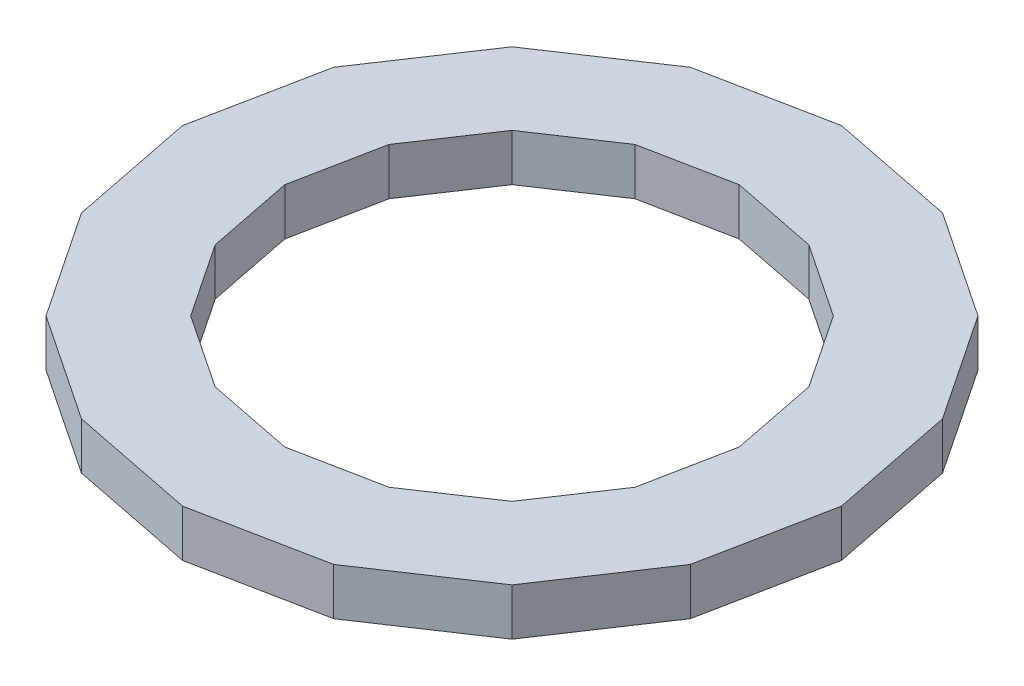
ISO-10303-21;
HEADER;
FILE_DESCRIPTION(('STEP AP214'),'2;1');
FILE_NAME('part.step','',(''),(''),'','','');
FILE_SCHEMA(('AUTOMOTIVE_DESIGN { 1 0 10303 214 1 1 1 1 }'));
ENDSEC;
DATA;
#1=APPLICATION_CONTEXT('core data for automotive mechanical design processes');
#2=APPLICATION_PROTOCOL_DEFINITION('international standard','automotive_design',2000,#1);
#3=PRODUCT_CONTEXT('',#1,'mechanical');
#4=PRODUCT('Part','Part','',(#3));
#5=PRODUCT_RELATED_PRODUCT_CATEGORY('part','',(#4));
#6=PRODUCT_DEFINITION_FORMATION('','',#4);
#7=PRODUCT_DEFINITION_CONTEXT('part definition',#1,'design');
#8=PRODUCT_DEFINITION('design','',#6,#7);
#9=PRODUCT_DEFINITION_SHAPE('','',#8);
#10=(LENGTH_UNIT() NAMED_UNIT(*) SI_UNIT(.MILLI.,.METRE.));
#11=(NAMED_UNIT(*) PLANE_ANGLE_UNIT() SI_UNIT($,.RADIAN.));
#12=(NAMED_UNIT(*) SI_UNIT($,.STERADIAN.) SOLID_ANGLE_UNIT());
#13=UNCERTAINTY_MEASURE_WITH_UNIT(LENGTH_MEASURE(1.E-05),#10,'distance_accuracy_value','');
#14=(GEOMETRIC_REPRESENTATION_CONTEXT(3) GLOBAL_UNCERTAINTY_ASSIGNED_CONTEXT((#13)) GLOBAL_UNIT_ASSIGNED_CONTEXT((#10,
#11,#12)) REPRESENTATION_CONTEXT('',''));
#15=CARTESIAN_POINT('',(0.,0.,0.));
#16=DIRECTION('',(0.,0.,1.));
#17=DIRECTION('',(1.,0.,0.));
#18=AXIS2_PLACEMENT_3D('',#15,#16,#17);
#19=CARTESIAN_POINT('',(0.,19.05,0.));
#20=DIRECTION('',(0.,1.,0.));
#21=DIRECTION('',(0.,0.,1.));
#22=AXIS2_PLACEMENT_3D('',#19,#20,#21);
#23=PLANE('',#22);
#24=DIRECTION('',(0.195090322016117,0.,-0.980785280403233));
#25=VECTOR('',#24,1.);
#26=CARTESIAN_POINT('',(123.292654296521,19.05,51.0694895505948));
#27=LINE('',#26,#25);
#28=CARTESIAN_POINT('',(123.292654296521,19.05,51.0694895505948));
#29=VERTEX_POINT('',#28);
#30=CARTESIAN_POINT('',(133.4510073639,19.05,-1.50226796198582E-12));
#31=VERTEX_POINT('',#30);
#32=EDGE_CURVE('E374',#29,#31,#27,.T.);
#33=ORIENTED_EDGE('',*,*,#32,.T.);
#34=DIRECTION('',(-0.195090322016139,0.,-0.980785280403228));
#35=VECTOR('',#34,1.);
#36=CARTESIAN_POINT('',(133.4510073639,19.05,-1.50226796198582E-12));
#37=LINE('',#36,#35);
#38=CARTESIAN_POINT('',(123.29265429652,19.05,-51.0694895505976));
#39=VERTEX_POINT('',#38);
#40=EDGE_CURVE('E377',#31,#39,#37,.T.);
#41=ORIENTED_EDGE('',*,*,#40,.T.);
#42=DIRECTION('',(-0.555570233019612,0.,-0.831469612302539));
#43=VECTOR('',#42,1.);
#44=CARTESIAN_POINT('',(123.29265429652,19.05,-51.0694895505976));
#45=LINE('',#44,#43);
#46=CARTESIAN_POINT('',(94.3641122631886,19.05,-94.3641122631908));
#47=VERTEX_POINT('',#46);
#48=EDGE_CURVE('E380',#39,#47,#45,.T.);
#49=ORIENTED_EDGE('',*,*,#48,.T.);
#50=DIRECTION('',(-0.831469612302552,0.,-0.555570233019593));
#51=VECTOR('',#50,1.);
#52=CARTESIAN_POINT('',(94.3641122631886,19.05,-94.3641122631908));
#53=LINE('',#52,#51);
#54=CARTESIAN_POINT('',(51.0694895505948,19.05,-123.292654296521));
#55=VERTEX_POINT('',#54);
#56=EDGE_CURVE('E382',#47,#55,#53,.T.);
#57=ORIENTED_EDGE('',*,*,#56,.T.);
#58=DIRECTION('',(-0.980785280403233,0.,-0.195090322016117));
#59=VECTOR('',#58,1.);
#60=CARTESIAN_POINT('',(51.0694895505948,19.05,-123.292654296521));
#61=LINE('',#60,#59);
#62=CARTESIAN_POINT('',(-1.5044756253617E-12,19.05,-133.4510073639));
#63=VERTEX_POINT('',#62);
#64=EDGE_CURVE('E384',#55,#63,#61,.T.);
#65=ORIENTED_EDGE('',*,*,#64,.T.);
#66=DIRECTION('',(-0.980785280403228,0.,0.19509032201614));
#67=VECTOR('',#66,1.);
#68=CARTESIAN_POINT('',(-1.5044756253617E-12,19.05,-133.4510073639));
#69=LINE('',#68,#67);
#70=CARTESIAN_POINT('',(-51.0694895505977,19.05,-123.29265429652));
#71=VERTEX_POINT('',#70);
#72=EDGE_CURVE('E386',#63,#71,#69,.T.);
#73=ORIENTED_EDGE('',*,*,#72,.T.);
#74=DIRECTION('',(-0.831469612302539,0.,0.555570233019612));
#75=VECTOR('',#74,1.);
#76=CARTESIAN_POINT('',(-51.0694895505977,19.05,-123.29265429652));
#77=LINE('',#76,#75);
#78=CARTESIAN_POINT('',(-94.3641122631908,19.05,-94.3641122631886));
#79=VERTEX_POINT('',#78);
#80=EDGE_CURVE('E388',#71,#79,#77,.T.);
#81=ORIENTED_EDGE('',*,*,#80,.T.);
#82=DIRECTION('',(-0.555570233019593,0.,0.831469612302552));
#83=VECTOR('',#82,1.);
#84=CARTESIAN_POINT('',(-94.3641122631908,19.05,-94.3641122631886));
#85=LINE('',#84,#83);
#86=CARTESIAN_POINT('',(-123.292654296521,19.05,-51.0694895505948));
#87=VERTEX_POINT('',#86);
#88=EDGE_CURVE('E391',#79,#87,#85,.T.);
#89=ORIENTED_EDGE('',*,*,#88,.T.);
#90=DIRECTION('',(-0.195090322016117,0.,0.980785280403233));
#91=VECTOR('',#90,1.);
#92=CARTESIAN_POINT('',(-123.292654296521,19.05,-51.0694895505948));
#93=LINE('',#92,#91);
#94=CARTESIAN_POINT('',(-133.4510073639,19.05,1.49280375468303E-12));
#95=VERTEX_POINT('',#94);
#96=EDGE_CURVE('E394',#87,#95,#93,.T.);
#97=ORIENTED_EDGE('',*,*,#96,.T.);
#98=DIRECTION('',(0.195090322016139,0.,0.980785280403228));
#99=VECTOR('',#98,1.);
#100=CARTESIAN_POINT('',(-133.4510073639,19.05,1.49280375468303E-12));
#101=LINE('',#100,#99);
#102=CARTESIAN_POINT('',(-123.29265429652,19.05,51.0694895505976));
#103=VERTEX_POINT('',#102);
#104=EDGE_CURVE('E396',#95,#103,#101,.T.);
#105=ORIENTED_EDGE('',*,*,#104,.T.);
#106=DIRECTION('',(0.555570233019612,0.,0.831469612302539));
#107=VECTOR('',#106,1.);
#108=CARTESIAN_POINT('',(-123.29265429652,19.05,51.0694895505976));
#109=LINE('',#108,#107);
#110=CARTESIAN_POINT('',(-94.3641122631886,19.05,94.3641122631908));
#111=VERTEX_POINT('',#110);
#112=EDGE_CURVE('E399',#103,#111,#109,.T.);
#113=ORIENTED_EDGE('',*,*,#112,.T.);
#114=DIRECTION('',(0.831469612302552,0.,0.555570233019593));
#115=VECTOR('',#114,1.);
#116=CARTESIAN_POINT('',(-94.3641122631886,19.05,94.3641122631908));
#117=LINE('',#116,#115);
#118=CARTESIAN_POINT('',(-51.0694895505949,19.05,123.292654296521));
#119=VERTEX_POINT('',#118);
#120=EDGE_CURVE('E402',#111,#119,#117,.T.);
#121=ORIENTED_EDGE('',*,*,#120,.T.);
#122=DIRECTION('',(0.980785280403233,0.,0.195090322016117));
#123=VECTOR('',#122,1.);
#124=CARTESIAN_POINT('',(-51.0694895505949,19.05,123.292654296521));
#125=LINE('',#124,#123);
#126=CARTESIAN_POINT('',(1.51123072391702E-12,19.05,133.4510073639));
#127=VERTEX_POINT('',#126);
#128=EDGE_CURVE('E405',#119,#127,#125,.T.);
#129=ORIENTED_EDGE('',*,*,#128,.T.);
#130=DIRECTION('',(0.980785280403228,0.,-0.195090322016139));
#131=VECTOR('',#130,1.);
#132=CARTESIAN_POINT('',(1.51123072391702E-12,19.05,133.4510073639));
#133=LINE('',#132,#131);
#134=CARTESIAN_POINT('',(51.0694895505976,19.05,123.29265429652));
#135=VERTEX_POINT('',#134);
#136=EDGE_CURVE('E407',#127,#135,#133,.T.);
#137=ORIENTED_EDGE('',*,*,#136,.T.);
#138=DIRECTION('',(0.831469612302539,0.,-0.555570233019612));
#139=VECTOR('',#138,1.);
#140=CARTESIAN_POINT('',(51.0694895505976,19.05,123.29265429652));
#141=LINE('',#140,#139);
#142=CARTESIAN_POINT('',(94.3641122631908,19.05,94.3641122631886));
#143=VERTEX_POINT('',#142);
#144=EDGE_CURVE('E410',#135,#143,#141,.T.);
#145=ORIENTED_EDGE('',*,*,#144,.T.);
#146=DIRECTION('',(0.555570233019593,0.,-0.831469612302552));
#147=VECTOR('',#146,1.);
#148=CARTESIAN_POINT('',(94.3641122631908,19.05,94.3641122631886));
#149=LINE('',#148,#147);
#150=EDGE_CURVE('E413',#143,#29,#149,.T.);
#151=ORIENTED_EDGE('',*,*,#150,.T.);
#152=EDGE_LOOP('',(#33,#41,#49,#57,#65,#73,#81,#89,#97,#105,#113,#121,#129,#137,#145,#151));
#153=FACE_BOUND('',#152,.T.);
#154=DIRECTION('',(-0.19509032201614,0.,-0.980785280403228));
#155=VECTOR('',#154,1.);
#156=CARTESIAN_POINT('',(92.0148226943141,19.05,-1.06197336720449E-12));
#157=LINE('',#156,#155);
#158=CARTESIAN_POINT('',(92.0148226943141,19.05,-1.06197336720449E-12));
#159=VERTEX_POINT('',#158);
#160=CARTESIAN_POINT('',(85.0106113749314,19.05,-35.2125481771262));
#161=VERTEX_POINT('',#160);
#162=EDGE_CURVE('E252',#159,#161,#157,.T.);
#163=ORIENTED_EDGE('',*,*,#162,.F.);
#164=DIRECTION('',(0.195090322016117,0.,-0.980785280403233));
#165=VECTOR('',#164,1.);
#166=CARTESIAN_POINT('',(85.0106113749323,19.05,35.2125481771242));
#167=LINE('',#166,#165);
#168=CARTESIAN_POINT('',(85.0106113749323,19.05,35.2125481771242));
#169=VERTEX_POINT('',#168);
#170=EDGE_CURVE('E243',#169,#159,#167,.T.);
#171=ORIENTED_EDGE('',*,*,#170,.F.);
#172=DIRECTION('',(0.555570233019593,0.,-0.831469612302552));
#173=VECTOR('',#172,1.);
#174=CARTESIAN_POINT('',(65.0643050968281,19.05,65.0643050968266));
#175=LINE('',#174,#173);
#176=CARTESIAN_POINT('',(65.0643050968281,19.05,65.0643050968266));
#177=VERTEX_POINT('',#176);
#178=EDGE_CURVE('E295',#177,#169,#175,.T.);
#179=ORIENTED_EDGE('',*,*,#178,.F.);
#180=DIRECTION('',(0.831469612302539,0.,-0.555570233019612));
#181=VECTOR('',#180,1.);
#182=CARTESIAN_POINT('',(35.2125481771263,19.05,85.0106113749314));
#183=LINE('',#182,#181);
#184=CARTESIAN_POINT('',(35.2125481771263,19.05,85.0106113749314));
#185=VERTEX_POINT('',#184);
#186=EDGE_CURVE('E293',#185,#177,#183,.T.);
#187=ORIENTED_EDGE('',*,*,#186,.F.);
#188=DIRECTION('',(0.980785280403228,0.,-0.19509032201614));
#189=VECTOR('',#188,1.);
#190=CARTESIAN_POINT('',(1.05708839277761E-12,19.05,92.0148226943141));
#191=LINE('',#190,#189);
#192=CARTESIAN_POINT('',(1.05708839277761E-12,19.05,92.0148226943141));
#193=VERTEX_POINT('',#192);
#194=EDGE_CURVE('E291',#193,#185,#191,.T.);
#195=ORIENTED_EDGE('',*,*,#194,.F.);
#196=DIRECTION('',(0.980785280403233,0.,0.195090322016117));
#197=VECTOR('',#196,1.);
#198=CARTESIAN_POINT('',(-35.2125481771242,19.05,85.0106113749323));
#199=LINE('',#198,#197);
#200=CARTESIAN_POINT('',(-35.2125481771242,19.05,85.0106113749323));
#201=VERTEX_POINT('',#200);
#202=EDGE_CURVE('E289',#201,#193,#199,.T.);
#203=ORIENTED_EDGE('',*,*,#202,.F.);
#204=DIRECTION('',(0.831469612302552,0.,0.555570233019592));
#205=VECTOR('',#204,1.);
#206=CARTESIAN_POINT('',(-65.0643050968265,19.05,65.0643050968281));
#207=LINE('',#206,#205);
#208=CARTESIAN_POINT('',(-65.0643050968265,19.05,65.0643050968281));
#209=VERTEX_POINT('',#208);
#210=EDGE_CURVE('E287',#209,#201,#207,.T.);
#211=ORIENTED_EDGE('',*,*,#210,.F.);
#212=DIRECTION('',(0.555570233019612,0.,0.831469612302539));
#213=VECTOR('',#212,1.);
#214=CARTESIAN_POINT('',(-85.0106113749314,19.05,35.2125481771263));
#215=LINE('',#214,#213);
#216=CARTESIAN_POINT('',(-85.0106113749314,19.05,35.2125481771263));
#217=VERTEX_POINT('',#216);
#218=EDGE_CURVE('E285',#217,#209,#215,.T.);
#219=ORIENTED_EDGE('',*,*,#218,.F.);
#220=DIRECTION('',(0.19509032201614,0.,0.980785280403228));
#221=VECTOR('',#220,1.);
#222=CARTESIAN_POINT('',(-92.0148226943141,19.05,1.08236908993088E-12));
#223=LINE('',#222,#221);
#224=CARTESIAN_POINT('',(-92.0148226943141,19.05,1.08236908993088E-12));
#225=VERTEX_POINT('',#224);
#226=EDGE_CURVE('E283',#225,#217,#223,.T.);
#227=ORIENTED_EDGE('',*,*,#226,.F.);
#228=DIRECTION('',(-0.195090322016117,0.,0.980785280403233));
#229=VECTOR('',#228,1.);
#230=CARTESIAN_POINT('',(-85.0106113749323,19.05,-35.2125481771242));
#231=LINE('',#230,#229);
#232=CARTESIAN_POINT('',(-85.0106113749323,19.05,-35.2125481771242));
#233=VERTEX_POINT('',#232);
#234=EDGE_CURVE('E280',#233,#225,#231,.T.);
#235=ORIENTED_EDGE('',*,*,#234,.F.);
#236=DIRECTION('',(-0.555570233019592,0.,0.831469612302552));
#237=VECTOR('',#236,1.);
#238=CARTESIAN_POINT('',(-65.0643050968281,19.05,-65.0643050968265));
#239=LINE('',#238,#237);
#240=CARTESIAN_POINT('',(-65.0643050968281,19.05,-65.0643050968265));
#241=VERTEX_POINT('',#240);
#242=EDGE_CURVE('E277',#241,#233,#239,.T.);
#243=ORIENTED_EDGE('',*,*,#242,.F.);
#244=DIRECTION('',(-0.831469612302539,0.,0.555570233019612));
#245=VECTOR('',#244,1.);
#246=CARTESIAN_POINT('',(-35.2125481771263,19.05,-85.0106113749314));
#247=LINE('',#246,#245);
#248=CARTESIAN_POINT('',(-35.2125481771263,19.05,-85.0106113749314));
#249=VERTEX_POINT('',#248);
#250=EDGE_CURVE('E275',#249,#241,#247,.T.);
#251=ORIENTED_EDGE('',*,*,#250,.F.);
#252=DIRECTION('',(-0.980785280403228,0.,0.19509032201614));
#253=VECTOR('',#252,1.);
#254=CARTESIAN_POINT('',(-1.1099913763659E-12,19.05,-92.014822694314));
#255=LINE('',#254,#253);
#256=CARTESIAN_POINT('',(-1.1099913763659E-12,19.05,-92.014822694314));
#257=VERTEX_POINT('',#256);
#258=EDGE_CURVE('E273',#257,#249,#255,.T.);
#259=ORIENTED_EDGE('',*,*,#258,.F.);
#260=DIRECTION('',(-0.980785280403233,0.,-0.195090322016116));
#261=VECTOR('',#260,1.);
#262=CARTESIAN_POINT('',(35.2125481771243,19.05,-85.0106113749322));
#263=LINE('',#262,#261);
#264=CARTESIAN_POINT('',(35.2125481771243,19.05,-85.0106113749322));
#265=VERTEX_POINT('',#264);
#266=EDGE_CURVE('E271',#265,#257,#263,.T.);
#267=ORIENTED_EDGE('',*,*,#266,.F.);
#268=DIRECTION('',(-0.831469612302552,0.,-0.555570233019593));
#269=VECTOR('',#268,1.);
#270=CARTESIAN_POINT('',(65.0643050968265,19.05,-65.0643050968281));
#271=LINE('',#270,#269);
#272=CARTESIAN_POINT('',(65.0643050968265,19.05,-65.0643050968281));
#273=VERTEX_POINT('',#272);
#274=EDGE_CURVE('E267',#273,#265,#271,.T.);
#275=ORIENTED_EDGE('',*,*,#274,.F.);
#276=DIRECTION('',(-0.555570233019612,0.,-0.831469612302539));
#277=VECTOR('',#276,1.);
#278=CARTESIAN_POINT('',(85.0106113749314,19.05,-35.2125481771262));
#279=LINE('',#278,#277);
#280=EDGE_CURVE('E265',#161,#273,#279,.T.);
#281=ORIENTED_EDGE('',*,*,#280,.F.);
#282=EDGE_LOOP('',(#163,#171,#179,#187,#195,#203,#211,#219,#227,#235,#243,#251,#259,#267,#275,#281));
#283=FACE_BOUND('',#282,.T.);
#284=ADVANCED_FACE('F34',(#153,#283),#23,.T.);
#285=CARTESIAN_POINT('',(0.,0.,0.));
#286=DIRECTION('',(0.,1.,0.));
#287=DIRECTION('',(0.,0.,1.));
#288=AXIS2_PLACEMENT_3D('',#285,#286,#287);
#289=PLANE('',#288);
#290=DIRECTION('',(0.195090322016117,0.,-0.980785280403233));
#291=VECTOR('',#290,1.);
#292=CARTESIAN_POINT('',(123.292654296521,0.,51.0694895505948));
#293=LINE('',#292,#291);
#294=CARTESIAN_POINT('',(123.292654296521,0.,51.0694895505948));
#295=VERTEX_POINT('',#294);
#296=CARTESIAN_POINT('',(133.4510073639,0.,-1.50226796198582E-12));
#297=VERTEX_POINT('',#296);
#298=EDGE_CURVE('E260',#295,#297,#293,.T.);
#299=ORIENTED_EDGE('',*,*,#298,.F.);
#300=DIRECTION('',(0.555570233019593,0.,-0.831469612302552));
#301=VECTOR('',#300,1.);
#302=CARTESIAN_POINT('',(94.3641122631908,0.,94.3641122631886));
#303=LINE('',#302,#301);
#304=CARTESIAN_POINT('',(94.3641122631908,0.,94.3641122631886));
#305=VERTEX_POINT('',#304);
#306=EDGE_CURVE('E378',#305,#295,#303,.T.);
#307=ORIENTED_EDGE('',*,*,#306,.F.);
#308=DIRECTION('',(0.831469612302539,0.,-0.555570233019612));
#309=VECTOR('',#308,1.);
#310=CARTESIAN_POINT('',(51.0694895505976,0.,123.29265429652));
#311=LINE('',#310,#309);
#312=CARTESIAN_POINT('',(51.0694895505976,0.,123.29265429652));
#313=VERTEX_POINT('',#312);
#314=EDGE_CURVE('E449',#313,#305,#311,.T.);
#315=ORIENTED_EDGE('',*,*,#314,.F.);
#316=DIRECTION('',(0.980785280403228,0.,-0.195090322016139));
#317=VECTOR('',#316,1.);
#318=CARTESIAN_POINT('',(1.51123072391702E-12,0.,133.4510073639));
#319=LINE('',#318,#317);
#320=CARTESIAN_POINT('',(1.51123072391702E-12,0.,133.4510073639));
#321=VERTEX_POINT('',#320);
#322=EDGE_CURVE('E446',#321,#313,#319,.T.);
#323=ORIENTED_EDGE('',*,*,#322,.F.);
#324=DIRECTION('',(0.980785280403233,0.,0.195090322016117));
#325=VECTOR('',#324,1.);
#326=CARTESIAN_POINT('',(-51.0694895505949,0.,123.292654296521));
#327=LINE('',#326,#325);
#328=CARTESIAN_POINT('',(-51.0694895505949,0.,123.292654296521));
#329=VERTEX_POINT('',#328);
#330=EDGE_CURVE('E443',#329,#321,#327,.T.);
#331=ORIENTED_EDGE('',*,*,#330,.F.);
#332=DIRECTION('',(0.831469612302552,0.,0.555570233019593));
#333=VECTOR('',#332,1.);
#334=CARTESIAN_POINT('',(-94.3641122631886,0.,94.3641122631908));
#335=LINE('',#334,#333);
#336=CARTESIAN_POINT('',(-94.3641122631886,0.,94.3641122631908));
#337=VERTEX_POINT('',#336);
#338=EDGE_CURVE('E440',#337,#329,#335,.T.);
#339=ORIENTED_EDGE('',*,*,#338,.F.);
#340=DIRECTION('',(0.555570233019612,0.,0.831469612302539));
#341=VECTOR('',#340,1.);
#342=CARTESIAN_POINT('',(-123.29265429652,0.,51.0694895505976));
#343=LINE('',#342,#341);
#344=CARTESIAN_POINT('',(-123.29265429652,0.,51.0694895505976));
#345=VERTEX_POINT('',#344);
#346=EDGE_CURVE('E438',#345,#337,#343,.T.);
#347=ORIENTED_EDGE('',*,*,#346,.F.);
#348=DIRECTION('',(0.195090322016139,0.,0.980785280403228));
#349=VECTOR('',#348,1.);
#350=CARTESIAN_POINT('',(-133.4510073639,0.,1.49280375468303E-12));
#351=LINE('',#350,#349);
#352=CARTESIAN_POINT('',(-133.4510073639,0.,1.49280375468303E-12));
#353=VERTEX_POINT('',#352);
#354=EDGE_CURVE('E435',#353,#345,#351,.T.);
#355=ORIENTED_EDGE('',*,*,#354,.F.);
#356=DIRECTION('',(-0.195090322016117,0.,0.980785280403233));
#357=VECTOR('',#356,1.);
#358=CARTESIAN_POINT('',(-123.292654296521,0.,-51.0694895505948));
#359=LINE('',#358,#357);
#360=CARTESIAN_POINT('',(-123.292654296521,0.,-51.0694895505948));
#361=VERTEX_POINT('',#360);
#362=EDGE_CURVE('E433',#361,#353,#359,.T.);
#363=ORIENTED_EDGE('',*,*,#362,.F.);
#364=DIRECTION('',(-0.555570233019593,0.,0.831469612302552));
#365=VECTOR('',#364,1.);
#366=CARTESIAN_POINT('',(-94.3641122631908,0.,-94.3641122631886));
#367=LINE('',#366,#365);
#368=CARTESIAN_POINT('',(-94.3641122631908,0.,-94.3641122631886));
#369=VERTEX_POINT('',#368);
#370=EDGE_CURVE('E430',#369,#361,#367,.T.);
#371=ORIENTED_EDGE('',*,*,#370,.F.);
#372=DIRECTION('',(-0.831469612302539,0.,0.555570233019612));
#373=VECTOR('',#372,1.);
#374=CARTESIAN_POINT('',(-51.0694895505977,0.,-123.29265429652));
#375=LINE('',#374,#373);
#376=CARTESIAN_POINT('',(-51.0694895505977,0.,-123.29265429652));
#377=VERTEX_POINT('',#376);
#378=EDGE_CURVE('E428',#377,#369,#375,.T.);
#379=ORIENTED_EDGE('',*,*,#378,.F.);
#380=DIRECTION('',(-0.980785280403228,0.,0.19509032201614));
#381=VECTOR('',#380,1.);
#382=CARTESIAN_POINT('',(-1.5044756253617E-12,0.,-133.4510073639));
#383=LINE('',#382,#381);
#384=CARTESIAN_POINT('',(-1.5044756253617E-12,0.,-133.4510073639));
#385=VERTEX_POINT('',#384);
#386=EDGE_CURVE('E426',#385,#377,#383,.T.);
#387=ORIENTED_EDGE('',*,*,#386,.F.);
#388=DIRECTION('',(-0.980785280403233,0.,-0.195090322016117));
#389=VECTOR('',#388,1.);
#390=CARTESIAN_POINT('',(51.0694895505948,0.,-123.292654296521));
#391=LINE('',#390,#389);
#392=CARTESIAN_POINT('',(51.0694895505948,0.,-123.292654296521));
#393=VERTEX_POINT('',#392);
#394=EDGE_CURVE('E424',#393,#385,#391,.T.);
#395=ORIENTED_EDGE('',*,*,#394,.F.);
#396=DIRECTION('',(-0.831469612302552,0.,-0.555570233019593));
#397=VECTOR('',#396,1.);
#398=CARTESIAN_POINT('',(94.3641122631886,0.,-94.3641122631908));
#399=LINE('',#398,#397);
#400=CARTESIAN_POINT('',(94.3641122631886,0.,-94.3641122631908));
#401=VERTEX_POINT('',#400);
#402=EDGE_CURVE('E422',#401,#393,#399,.T.);
#403=ORIENTED_EDGE('',*,*,#402,.F.);
#404=DIRECTION('',(-0.555570233019612,0.,-0.831469612302539));
#405=VECTOR('',#404,1.);
#406=CARTESIAN_POINT('',(123.29265429652,0.,-51.0694895505976));
#407=LINE('',#406,#405);
#408=CARTESIAN_POINT('',(123.29265429652,0.,-51.0694895505976));
#409=VERTEX_POINT('',#408);
#410=EDGE_CURVE('E420',#409,#401,#407,.T.);
#411=ORIENTED_EDGE('',*,*,#410,.F.);
#412=DIRECTION('',(-0.195090322016139,0.,-0.980785280403228));
#413=VECTOR('',#412,1.);
#414=CARTESIAN_POINT('',(133.4510073639,0.,-1.50226796198582E-12));
#415=LINE('',#414,#413);
#416=EDGE_CURVE('E418',#297,#409,#415,.T.);
#417=ORIENTED_EDGE('',*,*,#416,.F.);
#418=EDGE_LOOP('',(#299,#307,#315,#323,#331,#339,#347,#355,#363,#371,#379,#387,#395,#403,#411,#417));
#419=FACE_BOUND('',#418,.T.);
#420=DIRECTION('',(0.195090322016117,0.,-0.980785280403233));
#421=VECTOR('',#420,1.);
#422=CARTESIAN_POINT('',(85.0106113749323,0.,35.2125481771242));
#423=LINE('',#422,#421);
#424=CARTESIAN_POINT('',(85.0106113749323,0.,35.2125481771242));
#425=VERTEX_POINT('',#424);
#426=CARTESIAN_POINT('',(92.0148226943141,0.,-1.06197336720449E-12));
#427=VERTEX_POINT('',#426);
#428=EDGE_CURVE('E57',#425,#427,#423,.T.);
#429=ORIENTED_EDGE('',*,*,#428,.T.);
#430=DIRECTION('',(-0.19509032201614,0.,-0.980785280403228));
#431=VECTOR('',#430,1.);
#432=CARTESIAN_POINT('',(92.0148226943141,0.,-1.06197336720449E-12));
#433=LINE('',#432,#431);
#434=CARTESIAN_POINT('',(85.0106113749314,0.,-35.2125481771262));
#435=VERTEX_POINT('',#434);
#436=EDGE_CURVE('E259',#427,#435,#433,.T.);
#437=ORIENTED_EDGE('',*,*,#436,.T.);
#438=DIRECTION('',(-0.555570233019612,0.,-0.831469612302539));
#439=VECTOR('',#438,1.);
#440=CARTESIAN_POINT('',(85.0106113749314,0.,-35.2125481771262));
#441=LINE('',#440,#439);
#442=CARTESIAN_POINT('',(65.0643050968265,0.,-65.0643050968281));
#443=VERTEX_POINT('',#442);
#444=EDGE_CURVE('E300',#435,#443,#441,.T.);
#445=ORIENTED_EDGE('',*,*,#444,.T.);
#446=DIRECTION('',(-0.831469612302552,0.,-0.555570233019593));
#447=VECTOR('',#446,1.);
#448=CARTESIAN_POINT('',(65.0643050968265,0.,-65.0643050968281));
#449=LINE('',#448,#447);
#450=CARTESIAN_POINT('',(35.2125481771243,0.,-85.0106113749322));
#451=VERTEX_POINT('',#450);
#452=EDGE_CURVE('E303',#443,#451,#449,.T.);
#453=ORIENTED_EDGE('',*,*,#452,.T.);
#454=DIRECTION('',(-0.980785280403233,0.,-0.195090322016116));
#455=VECTOR('',#454,1.);
#456=CARTESIAN_POINT('',(35.2125481771243,0.,-85.0106113749322));
#457=LINE('',#456,#455);
#458=CARTESIAN_POINT('',(-1.1099913763659E-12,0.,-92.014822694314));
#459=VERTEX_POINT('',#458);
#460=EDGE_CURVE('E306',#451,#459,#457,.T.);
#461=ORIENTED_EDGE('',*,*,#460,.T.);
#462=DIRECTION('',(-0.980785280403228,0.,0.19509032201614));
#463=VECTOR('',#462,1.);
#464=CARTESIAN_POINT('',(-1.1099913763659E-12,0.,-92.014822694314));
#465=LINE('',#464,#463);
#466=CARTESIAN_POINT('',(-35.2125481771263,0.,-85.0106113749314));
#467=VERTEX_POINT('',#466);
#468=EDGE_CURVE('E309',#459,#467,#465,.T.);
#469=ORIENTED_EDGE('',*,*,#468,.T.);
#470=DIRECTION('',(-0.831469612302539,0.,0.555570233019612));
#471=VECTOR('',#470,1.);
#472=CARTESIAN_POINT('',(-35.2125481771263,0.,-85.0106113749314));
#473=LINE('',#472,#471);
#474=CARTESIAN_POINT('',(-65.0643050968281,0.,-65.0643050968265));
#475=VERTEX_POINT('',#474);
#476=EDGE_CURVE('E312',#467,#475,#473,.T.);
#477=ORIENTED_EDGE('',*,*,#476,.T.);
#478=DIRECTION('',(-0.555570233019592,0.,0.831469612302552));
#479=VECTOR('',#478,1.);
#480=CARTESIAN_POINT('',(-65.0643050968281,0.,-65.0643050968265));
#481=LINE('',#480,#479);
#482=CARTESIAN_POINT('',(-85.0106113749323,0.,-35.2125481771242));
#483=VERTEX_POINT('',#482);
#484=EDGE_CURVE('E315',#475,#483,#481,.T.);
#485=ORIENTED_EDGE('',*,*,#484,.T.);
#486=DIRECTION('',(-0.195090322016117,0.,0.980785280403233));
#487=VECTOR('',#486,1.);
#488=CARTESIAN_POINT('',(-85.0106113749323,0.,-35.2125481771242));
#489=LINE('',#488,#487);
#490=CARTESIAN_POINT('',(-92.0148226943141,0.,1.08236908993088E-12));
#491=VERTEX_POINT('',#490);
#492=EDGE_CURVE('E318',#483,#491,#489,.T.);
#493=ORIENTED_EDGE('',*,*,#492,.T.);
#494=DIRECTION('',(0.19509032201614,0.,0.980785280403228));
#495=VECTOR('',#494,1.);
#496=CARTESIAN_POINT('',(-92.0148226943141,0.,1.08236908993088E-12));
#497=LINE('',#496,#495);
#498=CARTESIAN_POINT('',(-85.0106113749314,0.,35.2125481771263));
#499=VERTEX_POINT('',#498);
#500=EDGE_CURVE('E322',#491,#499,#497,.T.);
#501=ORIENTED_EDGE('',*,*,#500,.T.);
#502=DIRECTION('',(0.555570233019612,0.,0.831469612302539));
#503=VECTOR('',#502,1.);
#504=CARTESIAN_POINT('',(-85.0106113749314,0.,35.2125481771263));
#505=LINE('',#504,#503);
#506=CARTESIAN_POINT('',(-65.0643050968265,0.,65.0643050968281));
#507=VERTEX_POINT('',#506);
#508=EDGE_CURVE('E326',#499,#507,#505,.T.);
#509=ORIENTED_EDGE('',*,*,#508,.T.);
#510=DIRECTION('',(0.831469612302552,0.,0.555570233019592));
#511=VECTOR('',#510,1.);
#512=CARTESIAN_POINT('',(-65.0643050968265,0.,65.0643050968281));
#513=LINE('',#512,#511);
#514=CARTESIAN_POINT('',(-35.2125481771242,0.,85.0106113749323));
#515=VERTEX_POINT('',#514);
#516=EDGE_CURVE('E329',#507,#515,#513,.T.);
#517=ORIENTED_EDGE('',*,*,#516,.T.);
#518=DIRECTION('',(0.980785280403233,0.,0.195090322016117));
#519=VECTOR('',#518,1.);
#520=CARTESIAN_POINT('',(-35.2125481771242,0.,85.0106113749323));
#521=LINE('',#520,#519);
#522=CARTESIAN_POINT('',(1.05708839277761E-12,0.,92.0148226943141));
#523=VERTEX_POINT('',#522);
#524=EDGE_CURVE('E332',#515,#523,#521,.T.);
#525=ORIENTED_EDGE('',*,*,#524,.T.);
#526=DIRECTION('',(0.980785280403228,0.,-0.19509032201614));
#527=VECTOR('',#526,1.);
#528=CARTESIAN_POINT('',(1.05708839277761E-12,0.,92.0148226943141));
#529=LINE('',#528,#527);
#530=CARTESIAN_POINT('',(35.2125481771263,0.,85.0106113749314));
#531=VERTEX_POINT('',#530);
#532=EDGE_CURVE('E335',#523,#531,#529,.T.);
#533=ORIENTED_EDGE('',*,*,#532,.T.);
#534=DIRECTION('',(0.831469612302539,0.,-0.555570233019612));
#535=VECTOR('',#534,1.);
#536=CARTESIAN_POINT('',(35.2125481771263,0.,85.0106113749314));
#537=LINE('',#536,#535);
#538=CARTESIAN_POINT('',(65.0643050968281,0.,65.0643050968266));
#539=VERTEX_POINT('',#538);
#540=EDGE_CURVE('E338',#531,#539,#537,.T.);
#541=ORIENTED_EDGE('',*,*,#540,.T.);
#542=DIRECTION('',(0.555570233019593,0.,-0.831469612302552));
#543=VECTOR('',#542,1.);
#544=CARTESIAN_POINT('',(65.0643050968281,0.,65.0643050968266));
#545=LINE('',#544,#543);
#546=EDGE_CURVE('E253',#539,#425,#545,.T.);
#547=ORIENTED_EDGE('',*,*,#546,.T.);
#548=EDGE_LOOP('',(#429,#437,#445,#453,#461,#469,#477,#485,#493,#501,#509,#517,#525,#533,#541,#547));
#549=FACE_BOUND('',#548,.T.);
#550=ADVANCED_FACE('F505',(#419,#549),#289,.F.);
#551=CARTESIAN_POINT('',(123.292654296521,19.05,51.0694895505948));
#552=DIRECTION('',(-0.980785280403233,0.,-0.195090322016117));
#553=DIRECTION('',(-0.195090322016117,0.,0.980785280403233));
#554=AXIS2_PLACEMENT_3D('',#551,#552,#553);
#555=PLANE('',#554);
#556=ORIENTED_EDGE('',*,*,#298,.T.);
#557=DIRECTION('',(0.,-1.,0.));
#558=VECTOR('',#557,1.);
#559=CARTESIAN_POINT('',(133.4510073639,19.05,-1.50226796198582E-12));
#560=LINE('',#559,#558);
#561=EDGE_CURVE('E11',#31,#297,#560,.T.);
#562=ORIENTED_EDGE('',*,*,#561,.F.);
#563=ORIENTED_EDGE('',*,*,#32,.F.);
#564=DIRECTION('',(0.,-1.,0.));
#565=VECTOR('',#564,1.);
#566=CARTESIAN_POINT('',(123.292654296521,19.05,51.0694895505948));
#567=LINE('',#566,#565);
#568=EDGE_CURVE('E415',#29,#295,#567,.T.);
#569=ORIENTED_EDGE('',*,*,#568,.T.);
#570=EDGE_LOOP('',(#556,#562,#563,#569));
#571=FACE_BOUND('',#570,.T.);
#572=ADVANCED_FACE('F36',(#571),#555,.F.);
#573=CARTESIAN_POINT('',(133.4510073639,19.05,-1.50226796198582E-12));
#574=DIRECTION('',(-0.980785280403228,0.,0.195090322016139));
#575=DIRECTION('',(0.195090322016139,0.,0.980785280403228));
#576=AXIS2_PLACEMENT_3D('',#573,#574,#575);
#577=PLANE('',#576);
#578=ORIENTED_EDGE('',*,*,#416,.T.);
#579=DIRECTION('',(0.,-1.,0.));
#580=VECTOR('',#579,1.);
#581=CARTESIAN_POINT('',(123.29265429652,19.05,-51.0694895505976));
#582=LINE('',#581,#580);
#583=EDGE_CURVE('E42',#39,#409,#582,.T.);
#584=ORIENTED_EDGE('',*,*,#583,.F.);
#585=ORIENTED_EDGE('',*,*,#40,.F.);
#586=ORIENTED_EDGE('',*,*,#561,.T.);
#587=EDGE_LOOP('',(#578,#584,#585,#586));
#588=FACE_BOUND('',#587,.T.);
#589=ADVANCED_FACE('F522',(#588),#577,.F.);
#590=CARTESIAN_POINT('',(123.29265429652,19.05,-51.0694895505976));
#591=DIRECTION('',(-0.831469612302539,0.,0.555570233019612));
#592=DIRECTION('',(0.555570233019612,0.,0.831469612302539));
#593=AXIS2_PLACEMENT_3D('',#590,#591,#592);
#594=PLANE('',#593);
#595=ORIENTED_EDGE('',*,*,#410,.T.);
#596=DIRECTION('',(0.,-1.,0.));
#597=VECTOR('',#596,1.);
#598=CARTESIAN_POINT('',(94.3641122631886,19.05,-94.3641122631908));
#599=LINE('',#598,#597);
#600=EDGE_CURVE('E492',#47,#401,#599,.T.);
#601=ORIENTED_EDGE('',*,*,#600,.F.);
#602=ORIENTED_EDGE('',*,*,#48,.F.);
#603=ORIENTED_EDGE('',*,*,#583,.T.);
#604=EDGE_LOOP('',(#595,#601,#602,#603));
#605=FACE_BOUND('',#604,.T.);
#606=ADVANCED_FACE('F499',(#605),#594,.F.);
#607=CARTESIAN_POINT('',(94.3641122631886,19.05,-94.3641122631908));
#608=DIRECTION('',(-0.555570233019593,0.,0.831469612302552));
#609=DIRECTION('',(0.831469612302552,0.,0.555570233019593));
#610=AXIS2_PLACEMENT_3D('',#607,#608,#609);
#611=PLANE('',#610);
#612=ORIENTED_EDGE('',*,*,#402,.T.);
#613=DIRECTION('',(0.,-1.,0.));
#614=VECTOR('',#613,1.);
#615=CARTESIAN_POINT('',(51.0694895505948,19.05,-123.292654296521));
#616=LINE('',#615,#614);
#617=EDGE_CURVE('E488',#55,#393,#616,.T.);
#618=ORIENTED_EDGE('',*,*,#617,.F.);
#619=ORIENTED_EDGE('',*,*,#56,.F.);
#620=ORIENTED_EDGE('',*,*,#600,.T.);
#621=EDGE_LOOP('',(#612,#618,#619,#620));
#622=FACE_BOUND('',#621,.T.);
#623=ADVANCED_FACE('F511',(#622),#611,.F.);
#624=CARTESIAN_POINT('',(51.0694895505948,19.05,-123.292654296521));
#625=DIRECTION('',(-0.195090322016117,0.,0.980785280403233));
#626=DIRECTION('',(0.980785280403233,0.,0.195090322016117));
#627=AXIS2_PLACEMENT_3D('',#624,#625,#626);
#628=PLANE('',#627);
#629=ORIENTED_EDGE('',*,*,#394,.T.);
#630=DIRECTION('',(0.,-1.,0.));
#631=VECTOR('',#630,1.);
#632=CARTESIAN_POINT('',(-1.5044756253617E-12,19.05,-133.4510073639));
#633=LINE('',#632,#631);
#634=EDGE_CURVE('E485',#63,#385,#633,.T.);
#635=ORIENTED_EDGE('',*,*,#634,.F.);
#636=ORIENTED_EDGE('',*,*,#64,.F.);
#637=ORIENTED_EDGE('',*,*,#617,.T.);
#638=EDGE_LOOP('',(#629,#635,#636,#637));
#639=FACE_BOUND('',#638,.T.);
#640=ADVANCED_FACE('F515',(#639),#628,.F.);
#641=CARTESIAN_POINT('',(-1.5044756253617E-12,19.05,-133.4510073639));
#642=DIRECTION('',(0.19509032201614,0.,0.980785280403228));
#643=DIRECTION('',(0.980785280403228,0.,-0.19509032201614));
#644=AXIS2_PLACEMENT_3D('',#641,#642,#643);
#645=PLANE('',#644);
#646=ORIENTED_EDGE('',*,*,#386,.T.);
#647=DIRECTION('',(0.,-1.,0.));
#648=VECTOR('',#647,1.);
#649=CARTESIAN_POINT('',(-51.0694895505977,19.05,-123.29265429652));
#650=LINE('',#649,#648);
#651=EDGE_CURVE('E482',#71,#377,#650,.T.);
#652=ORIENTED_EDGE('',*,*,#651,.F.);
#653=ORIENTED_EDGE('',*,*,#72,.F.);
#654=ORIENTED_EDGE('',*,*,#634,.T.);
#655=EDGE_LOOP('',(#646,#652,#653,#654));
#656=FACE_BOUND('',#655,.T.);
#657=ADVANCED_FACE('F575',(#656),#645,.F.);
#658=CARTESIAN_POINT('',(-51.0694895505977,19.05,-123.29265429652));
#659=DIRECTION('',(0.555570233019612,0.,0.831469612302539));
#660=DIRECTION('',(0.831469612302539,0.,-0.555570233019612));
#661=AXIS2_PLACEMENT_3D('',#658,#659,#660);
#662=PLANE('',#661);
#663=ORIENTED_EDGE('',*,*,#378,.T.);
#664=DIRECTION('',(0.,-1.,0.));
#665=VECTOR('',#664,1.);
#666=CARTESIAN_POINT('',(-94.3641122631908,19.05,-94.3641122631886));
#667=LINE('',#666,#665);
#668=EDGE_CURVE('E479',#79,#369,#667,.T.);
#669=ORIENTED_EDGE('',*,*,#668,.F.);
#670=ORIENTED_EDGE('',*,*,#80,.F.);
#671=ORIENTED_EDGE('',*,*,#651,.T.);
#672=EDGE_LOOP('',(#663,#669,#670,#671));
#673=FACE_BOUND('',#672,.T.);
#674=ADVANCED_FACE('F572',(#673),#662,.F.);
#675=CARTESIAN_POINT('',(-94.3641122631908,19.05,-94.3641122631886));
#676=DIRECTION('',(0.831469612302551,0.,0.555570233019593));
#677=DIRECTION('',(0.555570233019593,0.,-0.831469612302552));
#678=AXIS2_PLACEMENT_3D('',#675,#676,#677);
#679=PLANE('',#678);
#680=ORIENTED_EDGE('',*,*,#370,.T.);
#681=DIRECTION('',(0.,-1.,0.));
#682=VECTOR('',#681,1.);
#683=CARTESIAN_POINT('',(-123.292654296521,19.05,-51.0694895505948));
#684=LINE('',#683,#682);
#685=EDGE_CURVE('E476',#87,#361,#684,.T.);
#686=ORIENTED_EDGE('',*,*,#685,.F.);
#687=ORIENTED_EDGE('',*,*,#88,.F.);
#688=ORIENTED_EDGE('',*,*,#668,.T.);
#689=EDGE_LOOP('',(#680,#686,#687,#688));
#690=FACE_BOUND('',#689,.T.);
#691=ADVANCED_FACE('F568',(#690),#679,.F.);
#692=CARTESIAN_POINT('',(-123.292654296521,19.05,-51.0694895505948));
#693=DIRECTION('',(0.980785280403233,0.,0.195090322016117));
#694=DIRECTION('',(0.195090322016117,0.,-0.980785280403233));
#695=AXIS2_PLACEMENT_3D('',#692,#693,#694);
#696=PLANE('',#695);
#697=ORIENTED_EDGE('',*,*,#362,.T.);
#698=DIRECTION('',(0.,-1.,0.));
#699=VECTOR('',#698,1.);
#700=CARTESIAN_POINT('',(-133.4510073639,19.05,1.49280375468303E-12));
#701=LINE('',#700,#699);
#702=EDGE_CURVE('E473',#95,#353,#701,.T.);
#703=ORIENTED_EDGE('',*,*,#702,.F.);
#704=ORIENTED_EDGE('',*,*,#96,.F.);
#705=ORIENTED_EDGE('',*,*,#685,.T.);
#706=EDGE_LOOP('',(#697,#703,#704,#705));
#707=FACE_BOUND('',#706,.T.);
#708=ADVANCED_FACE('F564',(#707),#696,.F.);
#709=CARTESIAN_POINT('',(-133.4510073639,19.05,1.49280375468303E-12));
#710=DIRECTION('',(0.980785280403228,0.,-0.195090322016139));
#711=DIRECTION('',(-0.195090322016139,0.,-0.980785280403228));
#712=AXIS2_PLACEMENT_3D('',#709,#710,#711);
#713=PLANE('',#712);
#714=ORIENTED_EDGE('',*,*,#354,.T.);
#715=DIRECTION('',(0.,-1.,0.));
#716=VECTOR('',#715,1.);
#717=CARTESIAN_POINT('',(-123.29265429652,19.05,51.0694895505976));
#718=LINE('',#717,#716);
#719=EDGE_CURVE('E469',#103,#345,#718,.T.);
#720=ORIENTED_EDGE('',*,*,#719,.F.);
#721=ORIENTED_EDGE('',*,*,#104,.F.);
#722=ORIENTED_EDGE('',*,*,#702,.T.);
#723=EDGE_LOOP('',(#714,#720,#721,#722));
#724=FACE_BOUND('',#723,.T.);
#725=ADVANCED_FACE('F559',(#724),#713,.F.);
#726=CARTESIAN_POINT('',(-123.29265429652,19.05,51.0694895505976));
#727=DIRECTION('',(0.831469612302539,0.,-0.555570233019612));
#728=DIRECTION('',(-0.555570233019612,0.,-0.831469612302539));
#729=AXIS2_PLACEMENT_3D('',#726,#727,#728);
#730=PLANE('',#729);
#731=ORIENTED_EDGE('',*,*,#346,.T.);
#732=DIRECTION('',(0.,-1.,0.));
#733=VECTOR('',#732,1.);
#734=CARTESIAN_POINT('',(-94.3641122631886,19.05,94.3641122631908));
#735=LINE('',#734,#733);
#736=EDGE_CURVE('E466',#111,#337,#735,.T.);
#737=ORIENTED_EDGE('',*,*,#736,.F.);
#738=ORIENTED_EDGE('',*,*,#112,.F.);
#739=ORIENTED_EDGE('',*,*,#719,.T.);
#740=EDGE_LOOP('',(#731,#737,#738,#739));
#741=FACE_BOUND('',#740,.T.);
#742=ADVANCED_FACE('F553',(#741),#730,.F.);
#743=CARTESIAN_POINT('',(-94.3641122631886,19.05,94.3641122631908));
#744=DIRECTION('',(0.555570233019593,0.,-0.831469612302552));
#745=DIRECTION('',(-0.831469612302552,0.,-0.555570233019593));
#746=AXIS2_PLACEMENT_3D('',#743,#744,#745);
#747=PLANE('',#746);
#748=ORIENTED_EDGE('',*,*,#338,.T.);
#749=DIRECTION('',(0.,-1.,0.));
#750=VECTOR('',#749,1.);
#751=CARTESIAN_POINT('',(-51.0694895505949,19.05,123.292654296521));
#752=LINE('',#751,#750);
#753=EDGE_CURVE('E463',#119,#329,#752,.T.);
#754=ORIENTED_EDGE('',*,*,#753,.F.);
#755=ORIENTED_EDGE('',*,*,#120,.F.);
#756=ORIENTED_EDGE('',*,*,#736,.T.);
#757=EDGE_LOOP('',(#748,#754,#755,#756));
#758=FACE_BOUND('',#757,.T.);
#759=ADVANCED_FACE('F549',(#758),#747,.F.);
#760=CARTESIAN_POINT('',(-51.0694895505949,19.05,123.292654296521));
#761=DIRECTION('',(0.195090322016117,0.,-0.980785280403233));
#762=DIRECTION('',(-0.980785280403233,0.,-0.195090322016117));
#763=AXIS2_PLACEMENT_3D('',#760,#761,#762);
#764=PLANE('',#763);
#765=ORIENTED_EDGE('',*,*,#330,.T.);
#766=DIRECTION('',(0.,-1.,0.));
#767=VECTOR('',#766,1.);
#768=CARTESIAN_POINT('',(1.51123072391702E-12,19.05,133.4510073639));
#769=LINE('',#768,#767);
#770=EDGE_CURVE('E460',#127,#321,#769,.T.);
#771=ORIENTED_EDGE('',*,*,#770,.F.);
#772=ORIENTED_EDGE('',*,*,#128,.F.);
#773=ORIENTED_EDGE('',*,*,#753,.T.);
#774=EDGE_LOOP('',(#765,#771,#772,#773));
#775=FACE_BOUND('',#774,.T.);
#776=ADVANCED_FACE('F544',(#775),#764,.F.);
#777=CARTESIAN_POINT('',(1.51123072391702E-12,19.05,133.4510073639));
#778=DIRECTION('',(-0.195090322016139,0.,-0.980785280403228));
#779=DIRECTION('',(-0.980785280403228,0.,0.195090322016139));
#780=AXIS2_PLACEMENT_3D('',#777,#778,#779);
#781=PLANE('',#780);
#782=ORIENTED_EDGE('',*,*,#322,.T.);
#783=DIRECTION('',(0.,-1.,0.));
#784=VECTOR('',#783,1.);
#785=CARTESIAN_POINT('',(51.0694895505976,19.05,123.29265429652));
#786=LINE('',#785,#784);
#787=EDGE_CURVE('E457',#135,#313,#786,.T.);
#788=ORIENTED_EDGE('',*,*,#787,.F.);
#789=ORIENTED_EDGE('',*,*,#136,.F.);
#790=ORIENTED_EDGE('',*,*,#770,.T.);
#791=EDGE_LOOP('',(#782,#788,#789,#790));
#792=FACE_BOUND('',#791,.T.);
#793=ADVANCED_FACE('F538',(#792),#781,.F.);
#794=CARTESIAN_POINT('',(51.0694895505976,19.05,123.29265429652));
#795=DIRECTION('',(-0.555570233019612,0.,-0.831469612302539));
#796=DIRECTION('',(-0.831469612302539,0.,0.555570233019612));
#797=AXIS2_PLACEMENT_3D('',#794,#795,#796);
#798=PLANE('',#797);
#799=ORIENTED_EDGE('',*,*,#314,.T.);
#800=DIRECTION('',(0.,-1.,0.));
#801=VECTOR('',#800,1.);
#802=CARTESIAN_POINT('',(94.3641122631908,19.05,94.3641122631886));
#803=LINE('',#802,#801);
#804=EDGE_CURVE('E454',#143,#305,#803,.T.);
#805=ORIENTED_EDGE('',*,*,#804,.F.);
#806=ORIENTED_EDGE('',*,*,#144,.F.);
#807=ORIENTED_EDGE('',*,*,#787,.T.);
#808=EDGE_LOOP('',(#799,#805,#806,#807));
#809=FACE_BOUND('',#808,.T.);
#810=ADVANCED_FACE('F534',(#809),#798,.F.);
#811=CARTESIAN_POINT('',(94.3641122631908,19.05,94.3641122631886));
#812=DIRECTION('',(-0.831469612302552,0.,-0.555570233019593));
#813=DIRECTION('',(-0.555570233019593,0.,0.831469612302552));
#814=AXIS2_PLACEMENT_3D('',#811,#812,#813);
#815=PLANE('',#814);
#816=ORIENTED_EDGE('',*,*,#306,.T.);
#817=ORIENTED_EDGE('',*,*,#568,.F.);
#818=ORIENTED_EDGE('',*,*,#150,.F.);
#819=ORIENTED_EDGE('',*,*,#804,.T.);
#820=EDGE_LOOP('',(#816,#817,#818,#819));
#821=FACE_BOUND('',#820,.T.);
#822=ADVANCED_FACE('F529',(#821),#815,.F.);
#823=CARTESIAN_POINT('',(85.0106113749323,19.05,35.2125481771242));
#824=DIRECTION('',(-0.980785280403233,0.,-0.195090322016117));
#825=DIRECTION('',(-0.195090322016117,0.,0.980785280403233));
#826=AXIS2_PLACEMENT_3D('',#823,#824,#825);
#827=PLANE('',#826);
#828=ORIENTED_EDGE('',*,*,#428,.F.);
#829=DIRECTION('',(0.,-1.,0.));
#830=VECTOR('',#829,1.);
#831=CARTESIAN_POINT('',(85.0106113749323,19.05,35.2125481771242));
#832=LINE('',#831,#830);
#833=EDGE_CURVE('E247',#169,#425,#832,.T.);
#834=ORIENTED_EDGE('',*,*,#833,.F.);
#835=ORIENTED_EDGE('',*,*,#170,.T.);
#836=DIRECTION('',(0.,-1.,0.));
#837=VECTOR('',#836,1.);
#838=CARTESIAN_POINT('',(92.0148226943141,19.05,-1.06197336720449E-12));
#839=LINE('',#838,#837);
#840=EDGE_CURVE('E246',#159,#427,#839,.T.);
#841=ORIENTED_EDGE('',*,*,#840,.T.);
#842=EDGE_LOOP('',(#828,#834,#835,#841));
#843=FACE_BOUND('',#842,.T.);
#844=ADVANCED_FACE('F245',(#843),#827,.T.);
#845=CARTESIAN_POINT('',(92.0148226943141,19.05,-1.06197336720449E-12));
#846=DIRECTION('',(-0.980785280403228,0.,0.19509032201614));
#847=DIRECTION('',(0.19509032201614,0.,0.980785280403228));
#848=AXIS2_PLACEMENT_3D('',#845,#846,#847);
#849=PLANE('',#848);
#850=ORIENTED_EDGE('',*,*,#436,.F.);
#851=ORIENTED_EDGE('',*,*,#840,.F.);
#852=ORIENTED_EDGE('',*,*,#162,.T.);
#853=DIRECTION('',(0.,-1.,0.));
#854=VECTOR('',#853,1.);
#855=CARTESIAN_POINT('',(85.0106113749314,19.05,-35.2125481771262));
#856=LINE('',#855,#854);
#857=EDGE_CURVE('E261',#161,#435,#856,.T.);
#858=ORIENTED_EDGE('',*,*,#857,.T.);
#859=EDGE_LOOP('',(#850,#851,#852,#858));
#860=FACE_BOUND('',#859,.T.);
#861=ADVANCED_FACE('F256',(#860),#849,.T.);
#862=CARTESIAN_POINT('',(85.0106113749314,19.05,-35.2125481771262));
#863=DIRECTION('',(-0.831469612302539,0.,0.555570233019612));
#864=DIRECTION('',(0.555570233019612,0.,0.831469612302539));
#865=AXIS2_PLACEMENT_3D('',#862,#863,#864);
#866=PLANE('',#865);
#867=ORIENTED_EDGE('',*,*,#444,.F.);
#868=ORIENTED_EDGE('',*,*,#857,.F.);
#869=ORIENTED_EDGE('',*,*,#280,.T.);
#870=DIRECTION('',(0.,-1.,0.));
#871=VECTOR('',#870,1.);
#872=CARTESIAN_POINT('',(65.0643050968265,19.05,-65.0643050968281));
#873=LINE('',#872,#871);
#874=EDGE_CURVE('E371',#273,#443,#873,.T.);
#875=ORIENTED_EDGE('',*,*,#874,.T.);
#876=EDGE_LOOP('',(#867,#868,#869,#875));
#877=FACE_BOUND('',#876,.T.);
#878=ADVANCED_FACE('F657',(#877),#866,.T.);
#879=CARTESIAN_POINT('',(65.0643050968265,19.05,-65.0643050968281));
#880=DIRECTION('',(-0.555570233019593,0.,0.831469612302552));
#881=DIRECTION('',(0.831469612302552,0.,0.555570233019593));
#882=AXIS2_PLACEMENT_3D('',#879,#880,#881);
#883=PLANE('',#882);
#884=ORIENTED_EDGE('',*,*,#452,.F.);
#885=ORIENTED_EDGE('',*,*,#874,.F.);
#886=ORIENTED_EDGE('',*,*,#274,.T.);
#887=DIRECTION('',(0.,-1.,0.));
#888=VECTOR('',#887,1.);
#889=CARTESIAN_POINT('',(35.2125481771243,19.05,-85.0106113749322));
#890=LINE('',#889,#888);
#891=EDGE_CURVE('E369',#265,#451,#890,.T.);
#892=ORIENTED_EDGE('',*,*,#891,.T.);
#893=EDGE_LOOP('',(#884,#885,#886,#892));
#894=FACE_BOUND('',#893,.T.);
#895=ADVANCED_FACE('F663',(#894),#883,.T.);
#896=CARTESIAN_POINT('',(35.2125481771243,19.05,-85.0106113749322));
#897=DIRECTION('',(-0.195090322016116,0.,0.980785280403233));
#898=DIRECTION('',(0.980785280403233,0.,0.195090322016116));
#899=AXIS2_PLACEMENT_3D('',#896,#897,#898);
#900=PLANE('',#899);
#901=ORIENTED_EDGE('',*,*,#460,.F.);
#902=ORIENTED_EDGE('',*,*,#891,.F.);
#903=ORIENTED_EDGE('',*,*,#266,.T.);
#904=DIRECTION('',(0.,-1.,0.));
#905=VECTOR('',#904,1.);
#906=CARTESIAN_POINT('',(-1.1099913763659E-12,19.05,-92.014822694314));
#907=LINE('',#906,#905);
#908=EDGE_CURVE('E367',#257,#459,#907,.T.);
#909=ORIENTED_EDGE('',*,*,#908,.T.);
#910=EDGE_LOOP('',(#901,#902,#903,#909));
#911=FACE_BOUND('',#910,.T.);
#912=ADVANCED_FACE('F671',(#911),#900,.T.);
#913=CARTESIAN_POINT('',(-1.1099913763659E-12,19.05,-92.014822694314));
#914=DIRECTION('',(0.19509032201614,0.,0.980785280403228));
#915=DIRECTION('',(0.980785280403228,0.,-0.19509032201614));
#916=AXIS2_PLACEMENT_3D('',#913,#914,#915);
#917=PLANE('',#916);
#918=ORIENTED_EDGE('',*,*,#468,.F.);
#919=ORIENTED_EDGE('',*,*,#908,.F.);
#920=ORIENTED_EDGE('',*,*,#258,.T.);
#921=DIRECTION('',(0.,-1.,0.));
#922=VECTOR('',#921,1.);
#923=CARTESIAN_POINT('',(-35.2125481771263,19.05,-85.0106113749314));
#924=LINE('',#923,#922);
#925=EDGE_CURVE('E365',#249,#467,#924,.T.);
#926=ORIENTED_EDGE('',*,*,#925,.T.);
#927=EDGE_LOOP('',(#918,#919,#920,#926));
#928=FACE_BOUND('',#927,.T.);
#929=ADVANCED_FACE('F679',(#928),#917,.T.);
#930=CARTESIAN_POINT('',(-35.2125481771263,19.05,-85.0106113749314));
#931=DIRECTION('',(0.555570233019612,0.,0.831469612302539));
#932=DIRECTION('',(0.831469612302539,0.,-0.555570233019612));
#933=AXIS2_PLACEMENT_3D('',#930,#931,#932);
#934=PLANE('',#933);
#935=ORIENTED_EDGE('',*,*,#476,.F.);
#936=ORIENTED_EDGE('',*,*,#925,.F.);
#937=ORIENTED_EDGE('',*,*,#250,.T.);
#938=DIRECTION('',(0.,-1.,0.));
#939=VECTOR('',#938,1.);
#940=CARTESIAN_POINT('',(-65.0643050968281,19.05,-65.0643050968265));
#941=LINE('',#940,#939);
#942=EDGE_CURVE('E362',#241,#475,#941,.T.);
#943=ORIENTED_EDGE('',*,*,#942,.T.);
#944=EDGE_LOOP('',(#935,#936,#937,#943));
#945=FACE_BOUND('',#944,.T.);
#946=ADVANCED_FACE('F687',(#945),#934,.T.);
#947=CARTESIAN_POINT('',(-65.0643050968281,19.05,-65.0643050968265));
#948=DIRECTION('',(0.831469612302552,0.,0.555570233019592));
#949=DIRECTION('',(0.555570233019592,0.,-0.831469612302552));
#950=AXIS2_PLACEMENT_3D('',#947,#948,#949);
#951=PLANE('',#950);
#952=ORIENTED_EDGE('',*,*,#484,.F.);
#953=ORIENTED_EDGE('',*,*,#942,.F.);
#954=ORIENTED_EDGE('',*,*,#242,.T.);
#955=DIRECTION('',(0.,-1.,0.));
#956=VECTOR('',#955,1.);
#957=CARTESIAN_POINT('',(-85.0106113749323,19.05,-35.2125481771242));
#958=LINE('',#957,#956);
#959=EDGE_CURVE('E359',#233,#483,#958,.T.);
#960=ORIENTED_EDGE('',*,*,#959,.T.);
#961=EDGE_LOOP('',(#952,#953,#954,#960));
#962=FACE_BOUND('',#961,.T.);
#963=ADVANCED_FACE('F695',(#962),#951,.T.);
#964=CARTESIAN_POINT('',(-85.0106113749323,19.05,-35.2125481771242));
#965=DIRECTION('',(0.980785280403233,0.,0.195090322016117));
#966=DIRECTION('',(0.195090322016117,0.,-0.980785280403233));
#967=AXIS2_PLACEMENT_3D('',#964,#965,#966);
#968=PLANE('',#967);
#969=ORIENTED_EDGE('',*,*,#492,.F.);
#970=ORIENTED_EDGE('',*,*,#959,.F.);
#971=ORIENTED_EDGE('',*,*,#234,.T.);
#972=DIRECTION('',(0.,-1.,0.));
#973=VECTOR('',#972,1.);
#974=CARTESIAN_POINT('',(-92.0148226943141,19.05,1.08236908993088E-12));
#975=LINE('',#974,#973);
#976=EDGE_CURVE('E357',#225,#491,#975,.T.);
#977=ORIENTED_EDGE('',*,*,#976,.T.);
#978=EDGE_LOOP('',(#969,#970,#971,#977));
#979=FACE_BOUND('',#978,.T.);
#980=ADVANCED_FACE('F703',(#979),#968,.T.);
#981=CARTESIAN_POINT('',(-92.0148226943141,19.05,1.08236908993088E-12));
#982=DIRECTION('',(0.980785280403228,0.,-0.19509032201614));
#983=DIRECTION('',(-0.19509032201614,0.,-0.980785280403228));
#984=AXIS2_PLACEMENT_3D('',#981,#982,#983);
#985=PLANE('',#984);
#986=ORIENTED_EDGE('',*,*,#500,.F.);
#987=ORIENTED_EDGE('',*,*,#976,.F.);
#988=ORIENTED_EDGE('',*,*,#226,.T.);
#989=DIRECTION('',(0.,-1.,0.));
#990=VECTOR('',#989,1.);
#991=CARTESIAN_POINT('',(-85.0106113749314,19.05,35.2125481771263));
#992=LINE('',#991,#990);
#993=EDGE_CURVE('E355',#217,#499,#992,.T.);
#994=ORIENTED_EDGE('',*,*,#993,.T.);
#995=EDGE_LOOP('',(#986,#987,#988,#994));
#996=FACE_BOUND('',#995,.T.);
#997=ADVANCED_FACE('F711',(#996),#985,.T.);
#998=CARTESIAN_POINT('',(-85.0106113749314,19.05,35.2125481771263));
#999=DIRECTION('',(0.831469612302539,0.,-0.555570233019612));
#1000=DIRECTION('',(-0.555570233019612,0.,-0.831469612302539));
#1001=AXIS2_PLACEMENT_3D('',#998,#999,#1000);
#1002=PLANE('',#1001);
#1003=ORIENTED_EDGE('',*,*,#508,.F.);
#1004=ORIENTED_EDGE('',*,*,#993,.F.);
#1005=ORIENTED_EDGE('',*,*,#218,.T.);
#1006=DIRECTION('',(0.,-1.,0.));
#1007=VECTOR('',#1006,1.);
#1008=CARTESIAN_POINT('',(-65.0643050968265,19.05,65.0643050968281));
#1009=LINE('',#1008,#1007);
#1010=EDGE_CURVE('E352',#209,#507,#1009,.T.);
#1011=ORIENTED_EDGE('',*,*,#1010,.T.);
#1012=EDGE_LOOP('',(#1003,#1004,#1005,#1011));
#1013=FACE_BOUND('',#1012,.T.);
#1014=ADVANCED_FACE('F719',(#1013),#1002,.T.);
#1015=CARTESIAN_POINT('',(-65.0643050968265,19.05,65.0643050968281));
#1016=DIRECTION('',(0.555570233019592,0.,-0.831469612302552));
#1017=DIRECTION('',(-0.831469612302552,0.,-0.555570233019592));
#1018=AXIS2_PLACEMENT_3D('',#1015,#1016,#1017);
#1019=PLANE('',#1018);
#1020=ORIENTED_EDGE('',*,*,#516,.F.);
#1021=ORIENTED_EDGE('',*,*,#1010,.F.);
#1022=ORIENTED_EDGE('',*,*,#210,.T.);
#1023=DIRECTION('',(0.,-1.,0.));
#1024=VECTOR('',#1023,1.);
#1025=CARTESIAN_POINT('',(-35.2125481771242,19.05,85.0106113749323));
#1026=LINE('',#1025,#1024);
#1027=EDGE_CURVE('E350',#201,#515,#1026,.T.);
#1028=ORIENTED_EDGE('',*,*,#1027,.T.);
#1029=EDGE_LOOP('',(#1020,#1021,#1022,#1028));
#1030=FACE_BOUND('',#1029,.T.);
#1031=ADVANCED_FACE('F727',(#1030),#1019,.T.);
#1032=CARTESIAN_POINT('',(-35.2125481771242,19.05,85.0106113749323));
#1033=DIRECTION('',(0.195090322016117,0.,-0.980785280403233));
#1034=DIRECTION('',(-0.980785280403233,0.,-0.195090322016117));
#1035=AXIS2_PLACEMENT_3D('',#1032,#1033,#1034);
#1036=PLANE('',#1035);
#1037=ORIENTED_EDGE('',*,*,#524,.F.);
#1038=ORIENTED_EDGE('',*,*,#1027,.F.);
#1039=ORIENTED_EDGE('',*,*,#202,.T.);
#1040=DIRECTION('',(0.,-1.,0.));
#1041=VECTOR('',#1040,1.);
#1042=CARTESIAN_POINT('',(1.05708839277761E-12,19.05,92.0148226943141));
#1043=LINE('',#1042,#1041);
#1044=EDGE_CURVE('E348',#193,#523,#1043,.T.);
#1045=ORIENTED_EDGE('',*,*,#1044,.T.);
#1046=EDGE_LOOP('',(#1037,#1038,#1039,#1045));
#1047=FACE_BOUND('',#1046,.T.);
#1048=ADVANCED_FACE('F735',(#1047),#1036,.T.);
#1049=CARTESIAN_POINT('',(1.05708839277761E-12,19.05,92.0148226943141));
#1050=DIRECTION('',(-0.19509032201614,0.,-0.980785280403228));
#1051=DIRECTION('',(-0.980785280403228,0.,0.19509032201614));
#1052=AXIS2_PLACEMENT_3D('',#1049,#1050,#1051);
#1053=PLANE('',#1052);
#1054=ORIENTED_EDGE('',*,*,#532,.F.);
#1055=ORIENTED_EDGE('',*,*,#1044,.F.);
#1056=ORIENTED_EDGE('',*,*,#194,.T.);
#1057=DIRECTION('',(0.,-1.,0.));
#1058=VECTOR('',#1057,1.);
#1059=CARTESIAN_POINT('',(35.2125481771263,19.05,85.0106113749314));
#1060=LINE('',#1059,#1058);
#1061=EDGE_CURVE('E346',#185,#531,#1060,.T.);
#1062=ORIENTED_EDGE('',*,*,#1061,.T.);
#1063=EDGE_LOOP('',(#1054,#1055,#1056,#1062));
#1064=FACE_BOUND('',#1063,.T.);
#1065=ADVANCED_FACE('F743',(#1064),#1053,.T.);
#1066=CARTESIAN_POINT('',(35.2125481771263,19.05,85.0106113749314));
#1067=DIRECTION('',(-0.555570233019612,0.,-0.831469612302539));
#1068=DIRECTION('',(-0.831469612302539,0.,0.555570233019612));
#1069=AXIS2_PLACEMENT_3D('',#1066,#1067,#1068);
#1070=PLANE('',#1069);
#1071=ORIENTED_EDGE('',*,*,#540,.F.);
#1072=ORIENTED_EDGE('',*,*,#1061,.F.);
#1073=ORIENTED_EDGE('',*,*,#186,.T.);
#1074=DIRECTION('',(0.,-1.,0.));
#1075=VECTOR('',#1074,1.);
#1076=CARTESIAN_POINT('',(65.0643050968281,19.05,65.0643050968266));
#1077=LINE('',#1076,#1075);
#1078=EDGE_CURVE('E49',#177,#539,#1077,.T.);
#1079=ORIENTED_EDGE('',*,*,#1078,.T.);
#1080=EDGE_LOOP('',(#1071,#1072,#1073,#1079));
#1081=FACE_BOUND('',#1080,.T.);
#1082=ADVANCED_FACE('F751',(#1081),#1070,.T.);
#1083=CARTESIAN_POINT('',(65.0643050968281,19.05,65.0643050968266));
#1084=DIRECTION('',(-0.831469612302552,0.,-0.555570233019592));
#1085=DIRECTION('',(-0.555570233019593,0.,0.831469612302552));
#1086=AXIS2_PLACEMENT_3D('',#1083,#1084,#1085);
#1087=PLANE('',#1086);
#1088=ORIENTED_EDGE('',*,*,#546,.F.);
#1089=ORIENTED_EDGE('',*,*,#1078,.F.);
#1090=ORIENTED_EDGE('',*,*,#178,.T.);
#1091=ORIENTED_EDGE('',*,*,#833,.T.);
#1092=EDGE_LOOP('',(#1088,#1089,#1090,#1091));
#1093=FACE_BOUND('',#1092,.T.);
#1094=ADVANCED_FACE('F759',(#1093),#1087,.T.);
#1095=CLOSED_SHELL('',(#284,#550,#572,#589,#606,#623,#640,#657,#674,#691,#708,#725,#742,#759,
#776,#793,#810,#822,#844,#861,#878,#895,#912,#929,#946,#963,#980,#997,#1014,#1031,#1048,#1065,
#1082,#1094));
#1096=MANIFOLD_SOLID_BREP('B2',#1095);
#1097=ADVANCED_BREP_SHAPE_REPRESENTATION('',(#18,#1096),#14);
#1098=SHAPE_DEFINITION_REPRESENTATION(#9,#1097);
ENDSEC;
END-ISO-10303-21;
